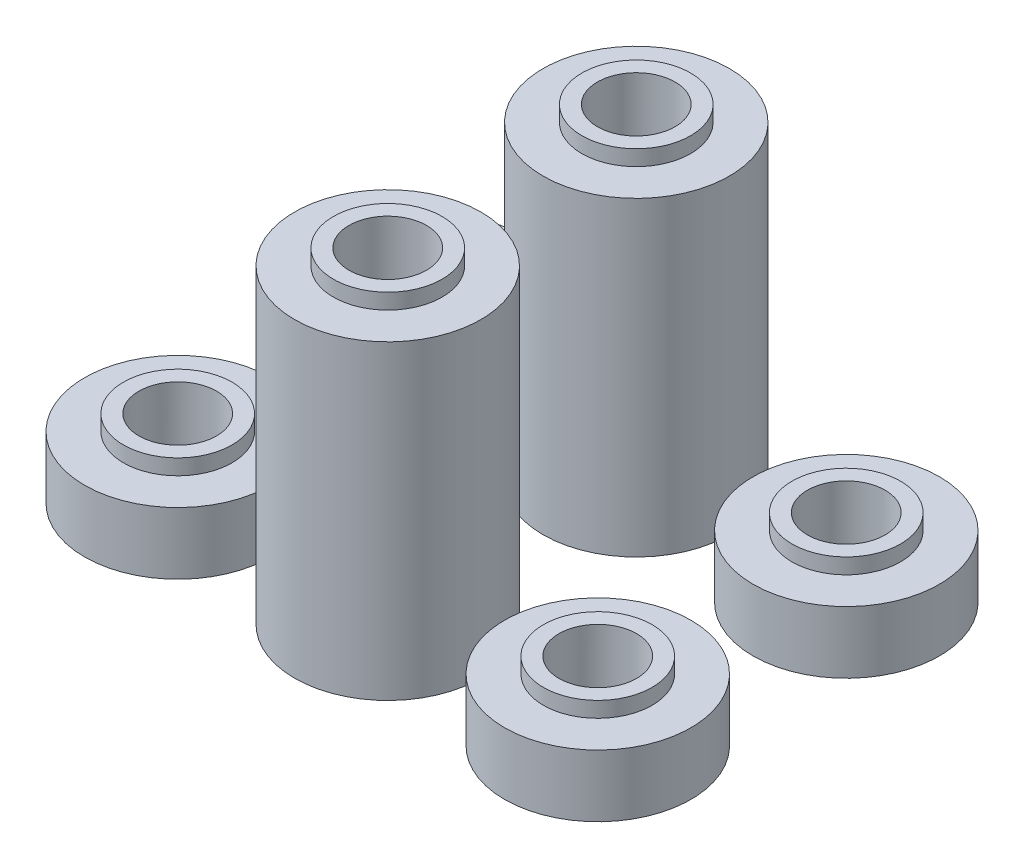
ISO-10303-21;
HEADER;
FILE_DESCRIPTION(('STEP AP214'),'2;1');
FILE_NAME('part.step','',(''),(''),'','','');
FILE_SCHEMA(('AUTOMOTIVE_DESIGN { 1 0 10303 214 1 1 1 1 }'));
ENDSEC;
DATA;
#1=APPLICATION_CONTEXT('core data for automotive mechanical design processes');
#2=APPLICATION_PROTOCOL_DEFINITION('international standard','automotive_design',2000,#1);
#3=PRODUCT_CONTEXT('',#1,'mechanical');
#4=PRODUCT('Part','Part','',(#3));
#5=PRODUCT_RELATED_PRODUCT_CATEGORY('part','',(#4));
#6=PRODUCT_DEFINITION_FORMATION('','',#4);
#7=PRODUCT_DEFINITION_CONTEXT('part definition',#1,'design');
#8=PRODUCT_DEFINITION('design','',#6,#7);
#9=PRODUCT_DEFINITION_SHAPE('','',#8);
#10=(LENGTH_UNIT() NAMED_UNIT(*) SI_UNIT(.MILLI.,.METRE.));
#11=(NAMED_UNIT(*) PLANE_ANGLE_UNIT() SI_UNIT($,.RADIAN.));
#12=(NAMED_UNIT(*) SI_UNIT($,.STERADIAN.) SOLID_ANGLE_UNIT());
#13=UNCERTAINTY_MEASURE_WITH_UNIT(LENGTH_MEASURE(1.E-05),#10,'distance_accuracy_value','');
#14=(GEOMETRIC_REPRESENTATION_CONTEXT(3) GLOBAL_UNCERTAINTY_ASSIGNED_CONTEXT((#13)) GLOBAL_UNIT_ASSIGNED_CONTEXT((#10,
#11,#12)) REPRESENTATION_CONTEXT('',''));
#15=CARTESIAN_POINT('',(0.,0.,0.));
#16=DIRECTION('',(0.,0.,1.));
#17=DIRECTION('',(1.,0.,0.));
#18=AXIS2_PLACEMENT_3D('',#15,#16,#17);
#19=CARTESIAN_POINT('',(-13.5219915750708,0.,16.));
#20=DIRECTION('',(0.,1.,0.));
#21=DIRECTION('',(0.,0.,-1.));
#22=AXIS2_PLACEMENT_3D('',#19,#20,#21);
#23=CYLINDRICAL_SURFACE('',#22,2.5);
#24=CARTESIAN_POINT('',(-13.5219915750708,5.,16.));
#25=DIRECTION('',(0.,-1.,0.));
#26=DIRECTION('',(0.,0.,-1.));
#27=AXIS2_PLACEMENT_3D('',#24,#25,#26);
#28=CIRCLE('',#27,2.5);
#29=CARTESIAN_POINT('',(-13.5219915750708,5.,13.5));
#30=VERTEX_POINT('',#29);
#31=EDGE_CURVE('E61',#30,#30,#28,.T.);
#32=ORIENTED_EDGE('',*,*,#31,.F.);
#33=EDGE_LOOP('',(#32));
#34=FACE_BOUND('',#33,.T.);
#35=CARTESIAN_POINT('',(-13.5219915750708,1.,16.));
#36=DIRECTION('',(0.,1.,0.));
#37=DIRECTION('',(0.,0.,1.));
#38=AXIS2_PLACEMENT_3D('',#35,#36,#37);
#39=CIRCLE('',#38,2.5);
#40=CARTESIAN_POINT('',(-13.5219915750708,1.,18.5));
#41=VERTEX_POINT('',#40);
#42=EDGE_CURVE('E70',#41,#41,#39,.T.);
#43=ORIENTED_EDGE('',*,*,#42,.F.);
#44=EDGE_LOOP('',(#43));
#45=FACE_BOUND('',#44,.T.);
#46=ADVANCED_FACE('F45',(#34,#45),#23,.F.);
#47=CARTESIAN_POINT('',(-13.5219915750708,4.,16.));
#48=DIRECTION('',(0.,1.,0.));
#49=DIRECTION('',(0.,0.,-1.));
#50=AXIS2_PLACEMENT_3D('',#47,#48,#49);
#51=PLANE('',#50);
#52=CARTESIAN_POINT('',(-13.5219915750708,4.,16.));
#53=DIRECTION('',(0.,-1.,0.));
#54=DIRECTION('',(0.,0.,-1.));
#55=AXIS2_PLACEMENT_3D('',#52,#53,#54);
#56=CIRCLE('',#55,6.);
#57=CARTESIAN_POINT('',(-13.5219915750708,4.,10.));
#58=VERTEX_POINT('',#57);
#59=EDGE_CURVE('E11',#58,#58,#56,.T.);
#60=ORIENTED_EDGE('',*,*,#59,.F.);
#61=EDGE_LOOP('',(#60));
#62=FACE_BOUND('',#61,.T.);
#63=CARTESIAN_POINT('',(-13.5219915750708,4.,16.));
#64=DIRECTION('',(0.,-1.,0.));
#65=DIRECTION('',(0.,0.,-1.));
#66=AXIS2_PLACEMENT_3D('',#63,#64,#65);
#67=CIRCLE('',#66,3.5);
#68=CARTESIAN_POINT('',(-13.5219915750708,4.,12.5));
#69=VERTEX_POINT('',#68);
#70=EDGE_CURVE('E58',#69,#69,#67,.T.);
#71=ORIENTED_EDGE('',*,*,#70,.T.);
#72=EDGE_LOOP('',(#71));
#73=FACE_BOUND('',#72,.T.);
#74=ADVANCED_FACE('F80',(#62,#73),#51,.T.);
#75=CARTESIAN_POINT('',(-13.5219915750708,4.,16.));
#76=DIRECTION('',(0.,-1.,0.));
#77=DIRECTION('',(0.,0.,1.));
#78=AXIS2_PLACEMENT_3D('',#75,#76,#77);
#79=CYLINDRICAL_SURFACE('',#78,6.);
#80=ORIENTED_EDGE('',*,*,#59,.T.);
#81=EDGE_LOOP('',(#80));
#82=FACE_BOUND('',#81,.T.);
#83=CARTESIAN_POINT('',(-13.5219915750708,0.,16.));
#84=DIRECTION('',(0.,-1.,0.));
#85=DIRECTION('',(0.,0.,-1.));
#86=AXIS2_PLACEMENT_3D('',#83,#84,#85);
#87=CIRCLE('',#86,6.);
#88=CARTESIAN_POINT('',(-13.5219915750708,0.,10.));
#89=VERTEX_POINT('',#88);
#90=EDGE_CURVE('E49',#89,#89,#87,.T.);
#91=ORIENTED_EDGE('',*,*,#90,.F.);
#92=EDGE_LOOP('',(#91));
#93=FACE_BOUND('',#92,.T.);
#94=ADVANCED_FACE('F47',(#82,#93),#79,.T.);
#95=CARTESIAN_POINT('',(-13.5219915750708,0.,16.));
#96=DIRECTION('',(0.,1.,0.));
#97=DIRECTION('',(0.,0.,-1.));
#98=AXIS2_PLACEMENT_3D('',#95,#96,#97);
#99=PLANE('',#98);
#100=CARTESIAN_POINT('',(-13.5219915750708,0.,16.));
#101=DIRECTION('',(0.,1.,0.));
#102=DIRECTION('',(0.,0.,1.));
#103=AXIS2_PLACEMENT_3D('',#100,#101,#102);
#104=CIRCLE('',#103,3.5);
#105=CARTESIAN_POINT('',(-13.5219915750708,0.,19.5));
#106=VERTEX_POINT('',#105);
#107=EDGE_CURVE('E67',#106,#106,#104,.T.);
#108=ORIENTED_EDGE('',*,*,#107,.T.);
#109=EDGE_LOOP('',(#108));
#110=FACE_BOUND('',#109,.T.);
#111=ORIENTED_EDGE('',*,*,#90,.T.);
#112=EDGE_LOOP('',(#111));
#113=FACE_BOUND('',#112,.T.);
#114=ADVANCED_FACE('F92',(#110,#113),#99,.F.);
#115=CARTESIAN_POINT('',(-13.5219915750708,5.,16.));
#116=DIRECTION('',(0.,1.,0.));
#117=DIRECTION('',(0.,0.,-1.));
#118=AXIS2_PLACEMENT_3D('',#115,#116,#117);
#119=PLANE('',#118);
#120=CARTESIAN_POINT('',(-13.5219915750708,5.,16.));
#121=DIRECTION('',(0.,-1.,0.));
#122=DIRECTION('',(0.,0.,-1.));
#123=AXIS2_PLACEMENT_3D('',#120,#121,#122);
#124=CIRCLE('',#123,3.5);
#125=CARTESIAN_POINT('',(-13.5219915750708,5.,12.5));
#126=VERTEX_POINT('',#125);
#127=EDGE_CURVE('E56',#126,#126,#124,.T.);
#128=ORIENTED_EDGE('',*,*,#127,.F.);
#129=EDGE_LOOP('',(#128));
#130=FACE_BOUND('',#129,.T.);
#131=ORIENTED_EDGE('',*,*,#31,.T.);
#132=EDGE_LOOP('',(#131));
#133=FACE_BOUND('',#132,.T.);
#134=ADVANCED_FACE('F94',(#130,#133),#119,.T.);
#135=CARTESIAN_POINT('',(-13.5219915750708,5.,16.));
#136=DIRECTION('',(0.,-1.,0.));
#137=DIRECTION('',(0.,0.,1.));
#138=AXIS2_PLACEMENT_3D('',#135,#136,#137);
#139=CYLINDRICAL_SURFACE('',#138,3.5);
#140=ORIENTED_EDGE('',*,*,#127,.T.);
#141=EDGE_LOOP('',(#140));
#142=FACE_BOUND('',#141,.T.);
#143=ORIENTED_EDGE('',*,*,#70,.F.);
#144=EDGE_LOOP('',(#143));
#145=FACE_BOUND('',#144,.T.);
#146=ADVANCED_FACE('F90',(#142,#145),#139,.T.);
#147=CARTESIAN_POINT('',(-13.5219915750708,1.,16.));
#148=DIRECTION('',(0.,-1.,0.));
#149=DIRECTION('',(0.,0.,1.));
#150=AXIS2_PLACEMENT_3D('',#147,#148,#149);
#151=CYLINDRICAL_SURFACE('',#150,3.5);
#152=CARTESIAN_POINT('',(-13.5219915750708,1.,16.));
#153=DIRECTION('',(0.,1.,0.));
#154=DIRECTION('',(0.,0.,1.));
#155=AXIS2_PLACEMENT_3D('',#152,#153,#154);
#156=CIRCLE('',#155,3.5);
#157=CARTESIAN_POINT('',(-13.5219915750708,1.,19.5));
#158=VERTEX_POINT('',#157);
#159=EDGE_CURVE('E66',#158,#158,#156,.T.);
#160=ORIENTED_EDGE('',*,*,#159,.T.);
#161=EDGE_LOOP('',(#160));
#162=FACE_BOUND('',#161,.T.);
#163=ORIENTED_EDGE('',*,*,#107,.F.);
#164=EDGE_LOOP('',(#163));
#165=FACE_BOUND('',#164,.T.);
#166=ADVANCED_FACE('F106',(#162,#165),#151,.F.);
#167=CARTESIAN_POINT('',(-13.5219915750708,1.,16.));
#168=DIRECTION('',(0.,-1.,0.));
#169=DIRECTION('',(0.,0.,1.));
#170=AXIS2_PLACEMENT_3D('',#167,#168,#169);
#171=PLANE('',#170);
#172=ORIENTED_EDGE('',*,*,#42,.T.);
#173=EDGE_LOOP('',(#172));
#174=FACE_BOUND('',#173,.T.);
#175=ORIENTED_EDGE('',*,*,#159,.F.);
#176=EDGE_LOOP('',(#175));
#177=FACE_BOUND('',#176,.T.);
#178=ADVANCED_FACE('F76',(#174,#177),#171,.T.);
#179=CLOSED_SHELL('',(#46,#74,#94,#114,#134,#146,#166,#178));
#180=MANIFOLD_SOLID_BREP('B2',#179);
#181=CARTESIAN_POINT('',(0.,0.,16.));
#182=DIRECTION('',(0.,1.,0.));
#183=DIRECTION('',(0.,0.,-1.));
#184=AXIS2_PLACEMENT_3D('',#181,#182,#183);
#185=CYLINDRICAL_SURFACE('',#184,2.5);
#186=CARTESIAN_POINT('',(0.,21.,16.));
#187=DIRECTION('',(0.,-1.,0.));
#188=DIRECTION('',(0.,0.,-1.));
#189=AXIS2_PLACEMENT_3D('',#186,#187,#188);
#190=CIRCLE('',#189,2.5);
#191=CARTESIAN_POINT('',(0.,21.,13.5));
#192=VERTEX_POINT('',#191);
#193=EDGE_CURVE('E198',#192,#192,#190,.T.);
#194=ORIENTED_EDGE('',*,*,#193,.F.);
#195=EDGE_LOOP('',(#194));
#196=FACE_BOUND('',#195,.T.);
#197=CARTESIAN_POINT('',(0.,5.,16.));
#198=DIRECTION('',(0.,1.,0.));
#199=DIRECTION('',(0.,0.,1.));
#200=AXIS2_PLACEMENT_3D('',#197,#198,#199);
#201=CIRCLE('',#200,2.5);
#202=CARTESIAN_POINT('',(0.,5.,18.5));
#203=VERTEX_POINT('',#202);
#204=EDGE_CURVE('E181',#203,#203,#201,.F.);
#205=ORIENTED_EDGE('',*,*,#204,.T.);
#206=EDGE_LOOP('',(#205));
#207=FACE_BOUND('',#206,.T.);
#208=ADVANCED_FACE('F177',(#196,#207),#185,.F.);
#209=CARTESIAN_POINT('',(0.,20.,16.));
#210=DIRECTION('',(0.,1.,0.));
#211=DIRECTION('',(0.,0.,-1.));
#212=AXIS2_PLACEMENT_3D('',#209,#210,#211);
#213=PLANE('',#212);
#214=CARTESIAN_POINT('',(0.,20.,16.));
#215=DIRECTION('',(0.,-1.,0.));
#216=DIRECTION('',(0.,0.,-1.));
#217=AXIS2_PLACEMENT_3D('',#214,#215,#216);
#218=CIRCLE('',#217,6.);
#219=CARTESIAN_POINT('',(0.,20.,10.));
#220=VERTEX_POINT('',#219);
#221=EDGE_CURVE('E44',#220,#220,#218,.T.);
#222=ORIENTED_EDGE('',*,*,#221,.F.);
#223=EDGE_LOOP('',(#222));
#224=FACE_BOUND('',#223,.T.);
#225=CARTESIAN_POINT('',(0.,20.,16.));
#226=DIRECTION('',(0.,-1.,0.));
#227=DIRECTION('',(0.,0.,-1.));
#228=AXIS2_PLACEMENT_3D('',#225,#226,#227);
#229=CIRCLE('',#228,3.5);
#230=CARTESIAN_POINT('',(0.,20.,12.5));
#231=VERTEX_POINT('',#230);
#232=EDGE_CURVE('E194',#231,#231,#229,.T.);
#233=ORIENTED_EDGE('',*,*,#232,.T.);
#234=EDGE_LOOP('',(#233));
#235=FACE_BOUND('',#234,.T.);
#236=ADVANCED_FACE('F234',(#224,#235),#213,.T.);
#237=CARTESIAN_POINT('',(0.,20.,16.));
#238=DIRECTION('',(0.,-1.,0.));
#239=DIRECTION('',(0.,0.,1.));
#240=AXIS2_PLACEMENT_3D('',#237,#238,#239);
#241=CYLINDRICAL_SURFACE('',#240,6.);
#242=ORIENTED_EDGE('',*,*,#221,.T.);
#243=EDGE_LOOP('',(#242));
#244=FACE_BOUND('',#243,.T.);
#245=CARTESIAN_POINT('',(0.,0.,16.));
#246=DIRECTION('',(0.,-1.,0.));
#247=DIRECTION('',(0.,0.,-1.));
#248=AXIS2_PLACEMENT_3D('',#245,#246,#247);
#249=CIRCLE('',#248,6.);
#250=CARTESIAN_POINT('',(0.,0.,10.));
#251=VERTEX_POINT('',#250);
#252=EDGE_CURVE('E186',#251,#251,#249,.T.);
#253=ORIENTED_EDGE('',*,*,#252,.F.);
#254=EDGE_LOOP('',(#253));
#255=FACE_BOUND('',#254,.T.);
#256=ADVANCED_FACE('F179',(#244,#255),#241,.T.);
#257=CARTESIAN_POINT('',(0.,0.,16.));
#258=DIRECTION('',(0.,1.,0.));
#259=DIRECTION('',(0.,0.,-1.));
#260=AXIS2_PLACEMENT_3D('',#257,#258,#259);
#261=PLANE('',#260);
#262=CARTESIAN_POINT('',(0.,0.,16.));
#263=DIRECTION('',(0.,1.,0.));
#264=DIRECTION('',(0.,0.,1.));
#265=AXIS2_PLACEMENT_3D('',#262,#263,#264);
#266=CIRCLE('',#265,4.5);
#267=CARTESIAN_POINT('',(0.,0.,20.5));
#268=VERTEX_POINT('',#267);
#269=EDGE_CURVE('E205',#268,#268,#266,.T.);
#270=ORIENTED_EDGE('',*,*,#269,.T.);
#271=EDGE_LOOP('',(#270));
#272=FACE_BOUND('',#271,.T.);
#273=ORIENTED_EDGE('',*,*,#252,.T.);
#274=EDGE_LOOP('',(#273));
#275=FACE_BOUND('',#274,.T.);
#276=ADVANCED_FACE('F244',(#272,#275),#261,.F.);
#277=CARTESIAN_POINT('',(0.,21.,16.));
#278=DIRECTION('',(0.,1.,0.));
#279=DIRECTION('',(0.,0.,-1.));
#280=AXIS2_PLACEMENT_3D('',#277,#278,#279);
#281=PLANE('',#280);
#282=CARTESIAN_POINT('',(0.,21.,16.));
#283=DIRECTION('',(0.,-1.,0.));
#284=DIRECTION('',(0.,0.,-1.));
#285=AXIS2_PLACEMENT_3D('',#282,#283,#284);
#286=CIRCLE('',#285,3.5);
#287=CARTESIAN_POINT('',(0.,21.,12.5));
#288=VERTEX_POINT('',#287);
#289=EDGE_CURVE('E192',#288,#288,#286,.T.);
#290=ORIENTED_EDGE('',*,*,#289,.F.);
#291=EDGE_LOOP('',(#290));
#292=FACE_BOUND('',#291,.T.);
#293=ORIENTED_EDGE('',*,*,#193,.T.);
#294=EDGE_LOOP('',(#293));
#295=FACE_BOUND('',#294,.T.);
#296=ADVANCED_FACE('F230',(#292,#295),#281,.T.);
#297=CARTESIAN_POINT('',(0.,21.,16.));
#298=DIRECTION('',(0.,-1.,0.));
#299=DIRECTION('',(0.,0.,1.));
#300=AXIS2_PLACEMENT_3D('',#297,#298,#299);
#301=CYLINDRICAL_SURFACE('',#300,3.5);
#302=ORIENTED_EDGE('',*,*,#289,.T.);
#303=EDGE_LOOP('',(#302));
#304=FACE_BOUND('',#303,.T.);
#305=ORIENTED_EDGE('',*,*,#232,.F.);
#306=EDGE_LOOP('',(#305));
#307=FACE_BOUND('',#306,.T.);
#308=ADVANCED_FACE('F222',(#304,#307),#301,.T.);
#309=CARTESIAN_POINT('',(0.,5.,16.));
#310=DIRECTION('',(0.,-1.,0.));
#311=DIRECTION('',(0.,0.,1.));
#312=AXIS2_PLACEMENT_3D('',#309,#310,#311);
#313=PLANE('',#312);
#314=CARTESIAN_POINT('',(0.,5.,16.));
#315=DIRECTION('',(0.,1.,0.));
#316=DIRECTION('',(0.,0.,1.));
#317=AXIS2_PLACEMENT_3D('',#314,#315,#316);
#318=CIRCLE('',#317,4.5);
#319=CARTESIAN_POINT('',(0.,5.,20.5));
#320=VERTEX_POINT('',#319);
#321=EDGE_CURVE('E209',#320,#320,#318,.T.);
#322=ORIENTED_EDGE('',*,*,#321,.F.);
#323=EDGE_LOOP('',(#322));
#324=FACE_BOUND('',#323,.T.);
#325=ORIENTED_EDGE('',*,*,#204,.F.);
#326=EDGE_LOOP('',(#325));
#327=FACE_BOUND('',#326,.T.);
#328=ADVANCED_FACE('F219',(#324,#327),#313,.T.);
#329=CARTESIAN_POINT('',(0.,5.,16.));
#330=DIRECTION('',(0.,-1.,0.));
#331=DIRECTION('',(0.,0.,1.));
#332=AXIS2_PLACEMENT_3D('',#329,#330,#331);
#333=CYLINDRICAL_SURFACE('',#332,4.5);
#334=ORIENTED_EDGE('',*,*,#321,.T.);
#335=EDGE_LOOP('',(#334));
#336=FACE_BOUND('',#335,.T.);
#337=ORIENTED_EDGE('',*,*,#269,.F.);
#338=EDGE_LOOP('',(#337));
#339=FACE_BOUND('',#338,.T.);
#340=ADVANCED_FACE('F221',(#336,#339),#333,.F.);
#341=CLOSED_SHELL('',(#208,#236,#256,#276,#296,#308,#328,#340));
#342=MANIFOLD_SOLID_BREP('B6',#341);
#343=CARTESIAN_POINT('',(13.5219915750708,0.,16.));
#344=DIRECTION('',(0.,1.,0.));
#345=DIRECTION('',(0.,0.,-1.));
#346=AXIS2_PLACEMENT_3D('',#343,#344,#345);
#347=CYLINDRICAL_SURFACE('',#346,2.5);
#348=CARTESIAN_POINT('',(13.5219915750708,5.,16.));
#349=DIRECTION('',(0.,1.,0.));
#350=DIRECTION('',(0.,0.,-1.));
#351=AXIS2_PLACEMENT_3D('',#348,#349,#350);
#352=CIRCLE('',#351,2.5);
#353=CARTESIAN_POINT('',(13.5219915750708,5.,13.5));
#354=VERTEX_POINT('',#353);
#355=EDGE_CURVE('E333',#354,#354,#352,.T.);
#356=ORIENTED_EDGE('',*,*,#355,.T.);
#357=EDGE_LOOP('',(#356));
#358=FACE_BOUND('',#357,.T.);
#359=CARTESIAN_POINT('',(13.5219915750708,1.,16.));
#360=DIRECTION('',(0.,-1.,0.));
#361=DIRECTION('',(0.,0.,1.));
#362=AXIS2_PLACEMENT_3D('',#359,#360,#361);
#363=CIRCLE('',#362,2.5);
#364=CARTESIAN_POINT('',(13.5219915750708,1.,18.5));
#365=VERTEX_POINT('',#364);
#366=EDGE_CURVE('E342',#365,#365,#363,.T.);
#367=ORIENTED_EDGE('',*,*,#366,.T.);
#368=EDGE_LOOP('',(#367));
#369=FACE_BOUND('',#368,.T.);
#370=ADVANCED_FACE('F317',(#358,#369),#347,.F.);
#371=CARTESIAN_POINT('',(13.5219915750708,4.,16.));
#372=DIRECTION('',(0.,1.,0.));
#373=DIRECTION('',(0.,0.,-1.));
#374=AXIS2_PLACEMENT_3D('',#371,#372,#373);
#375=PLANE('',#374);
#376=CARTESIAN_POINT('',(13.5219915750708,4.,16.));
#377=DIRECTION('',(0.,1.,0.));
#378=DIRECTION('',(0.,0.,-1.));
#379=AXIS2_PLACEMENT_3D('',#376,#377,#378);
#380=CIRCLE('',#379,6.);
#381=CARTESIAN_POINT('',(13.5219915750708,4.,10.));
#382=VERTEX_POINT('',#381);
#383=EDGE_CURVE('E176',#382,#382,#380,.T.);
#384=ORIENTED_EDGE('',*,*,#383,.T.);
#385=EDGE_LOOP('',(#384));
#386=FACE_BOUND('',#385,.T.);
#387=CARTESIAN_POINT('',(13.5219915750708,4.,16.));
#388=DIRECTION('',(0.,1.,0.));
#389=DIRECTION('',(0.,0.,-1.));
#390=AXIS2_PLACEMENT_3D('',#387,#388,#389);
#391=CIRCLE('',#390,3.5);
#392=CARTESIAN_POINT('',(13.5219915750708,4.,12.5));
#393=VERTEX_POINT('',#392);
#394=EDGE_CURVE('E330',#393,#393,#391,.T.);
#395=ORIENTED_EDGE('',*,*,#394,.F.);
#396=EDGE_LOOP('',(#395));
#397=FACE_BOUND('',#396,.T.);
#398=ADVANCED_FACE('F369',(#386,#397),#375,.T.);
#399=CARTESIAN_POINT('',(13.5219915750708,4.,16.));
#400=DIRECTION('',(0.,-1.,0.));
#401=DIRECTION('',(0.,0.,1.));
#402=AXIS2_PLACEMENT_3D('',#399,#400,#401);
#403=CYLINDRICAL_SURFACE('',#402,6.);
#404=ORIENTED_EDGE('',*,*,#383,.F.);
#405=EDGE_LOOP('',(#404));
#406=FACE_BOUND('',#405,.T.);
#407=CARTESIAN_POINT('',(13.5219915750708,0.,16.));
#408=DIRECTION('',(0.,1.,0.));
#409=DIRECTION('',(0.,0.,-1.));
#410=AXIS2_PLACEMENT_3D('',#407,#408,#409);
#411=CIRCLE('',#410,6.);
#412=CARTESIAN_POINT('',(13.5219915750708,0.,10.));
#413=VERTEX_POINT('',#412);
#414=EDGE_CURVE('E321',#413,#413,#411,.T.);
#415=ORIENTED_EDGE('',*,*,#414,.T.);
#416=EDGE_LOOP('',(#415));
#417=FACE_BOUND('',#416,.T.);
#418=ADVANCED_FACE('F319',(#406,#417),#403,.T.);
#419=CARTESIAN_POINT('',(13.5219915750708,0.,16.));
#420=DIRECTION('',(0.,1.,0.));
#421=DIRECTION('',(0.,0.,-1.));
#422=AXIS2_PLACEMENT_3D('',#419,#420,#421);
#423=PLANE('',#422);
#424=CARTESIAN_POINT('',(13.5219915750708,0.,16.));
#425=DIRECTION('',(0.,-1.,0.));
#426=DIRECTION('',(0.,0.,1.));
#427=AXIS2_PLACEMENT_3D('',#424,#425,#426);
#428=CIRCLE('',#427,3.5);
#429=CARTESIAN_POINT('',(13.5219915750708,0.,19.5));
#430=VERTEX_POINT('',#429);
#431=EDGE_CURVE('E339',#430,#430,#428,.T.);
#432=ORIENTED_EDGE('',*,*,#431,.F.);
#433=EDGE_LOOP('',(#432));
#434=FACE_BOUND('',#433,.T.);
#435=ORIENTED_EDGE('',*,*,#414,.F.);
#436=EDGE_LOOP('',(#435));
#437=FACE_BOUND('',#436,.T.);
#438=ADVANCED_FACE('F362',(#434,#437),#423,.F.);
#439=CARTESIAN_POINT('',(13.5219915750708,5.,16.));
#440=DIRECTION('',(0.,1.,0.));
#441=DIRECTION('',(0.,0.,-1.));
#442=AXIS2_PLACEMENT_3D('',#439,#440,#441);
#443=PLANE('',#442);
#444=CARTESIAN_POINT('',(13.5219915750708,5.,16.));
#445=DIRECTION('',(0.,1.,0.));
#446=DIRECTION('',(0.,0.,-1.));
#447=AXIS2_PLACEMENT_3D('',#444,#445,#446);
#448=CIRCLE('',#447,3.5);
#449=CARTESIAN_POINT('',(13.5219915750708,5.,12.5));
#450=VERTEX_POINT('',#449);
#451=EDGE_CURVE('E328',#450,#450,#448,.T.);
#452=ORIENTED_EDGE('',*,*,#451,.T.);
#453=EDGE_LOOP('',(#452));
#454=FACE_BOUND('',#453,.T.);
#455=ORIENTED_EDGE('',*,*,#355,.F.);
#456=EDGE_LOOP('',(#455));
#457=FACE_BOUND('',#456,.T.);
#458=ADVANCED_FACE('F365',(#454,#457),#443,.T.);
#459=CARTESIAN_POINT('',(13.5219915750708,5.,16.));
#460=DIRECTION('',(0.,-1.,0.));
#461=DIRECTION('',(0.,0.,1.));
#462=AXIS2_PLACEMENT_3D('',#459,#460,#461);
#463=CYLINDRICAL_SURFACE('',#462,3.5);
#464=ORIENTED_EDGE('',*,*,#451,.F.);
#465=EDGE_LOOP('',(#464));
#466=FACE_BOUND('',#465,.T.);
#467=ORIENTED_EDGE('',*,*,#394,.T.);
#468=EDGE_LOOP('',(#467));
#469=FACE_BOUND('',#468,.T.);
#470=ADVANCED_FACE('F358',(#466,#469),#463,.T.);
#471=CARTESIAN_POINT('',(13.5219915750708,1.,16.));
#472=DIRECTION('',(0.,-1.,0.));
#473=DIRECTION('',(0.,0.,1.));
#474=AXIS2_PLACEMENT_3D('',#471,#472,#473);
#475=CYLINDRICAL_SURFACE('',#474,3.5);
#476=CARTESIAN_POINT('',(13.5219915750708,1.,16.));
#477=DIRECTION('',(0.,-1.,0.));
#478=DIRECTION('',(0.,0.,1.));
#479=AXIS2_PLACEMENT_3D('',#476,#477,#478);
#480=CIRCLE('',#479,3.5);
#481=CARTESIAN_POINT('',(13.5219915750708,1.,19.5));
#482=VERTEX_POINT('',#481);
#483=EDGE_CURVE('E338',#482,#482,#480,.T.);
#484=ORIENTED_EDGE('',*,*,#483,.F.);
#485=EDGE_LOOP('',(#484));
#486=FACE_BOUND('',#485,.T.);
#487=ORIENTED_EDGE('',*,*,#431,.T.);
#488=EDGE_LOOP('',(#487));
#489=FACE_BOUND('',#488,.T.);
#490=ADVANCED_FACE('F352',(#486,#489),#475,.F.);
#491=CARTESIAN_POINT('',(13.5219915750708,1.,16.));
#492=DIRECTION('',(0.,-1.,0.));
#493=DIRECTION('',(0.,0.,1.));
#494=AXIS2_PLACEMENT_3D('',#491,#492,#493);
#495=PLANE('',#494);
#496=ORIENTED_EDGE('',*,*,#366,.F.);
#497=EDGE_LOOP('',(#496));
#498=FACE_BOUND('',#497,.T.);
#499=ORIENTED_EDGE('',*,*,#483,.T.);
#500=EDGE_LOOP('',(#499));
#501=FACE_BOUND('',#500,.T.);
#502=ADVANCED_FACE('F349',(#498,#501),#495,.T.);
#503=CLOSED_SHELL('',(#370,#398,#418,#438,#458,#470,#490,#502));
#504=MANIFOLD_SOLID_BREP('B39',#503);
#505=CARTESIAN_POINT('',(13.5219915750708,0.,0.));
#506=DIRECTION('',(0.,1.,0.));
#507=DIRECTION('',(0.,0.,1.));
#508=AXIS2_PLACEMENT_3D('',#505,#506,#507);
#509=CYLINDRICAL_SURFACE('',#508,2.5);
#510=CARTESIAN_POINT('',(13.5219915750708,5.,0.));
#511=DIRECTION('',(0.,-1.,0.));
#512=DIRECTION('',(0.,0.,1.));
#513=AXIS2_PLACEMENT_3D('',#510,#511,#512);
#514=CIRCLE('',#513,2.5);
#515=CARTESIAN_POINT('',(13.5219915750708,5.,2.5));
#516=VERTEX_POINT('',#515);
#517=EDGE_CURVE('E465',#516,#516,#514,.T.);
#518=ORIENTED_EDGE('',*,*,#517,.F.);
#519=EDGE_LOOP('',(#518));
#520=FACE_BOUND('',#519,.T.);
#521=CARTESIAN_POINT('',(13.5219915750708,1.,0.));
#522=DIRECTION('',(0.,1.,0.));
#523=DIRECTION('',(0.,0.,-1.));
#524=AXIS2_PLACEMENT_3D('',#521,#522,#523);
#525=CIRCLE('',#524,2.5);
#526=CARTESIAN_POINT('',(13.5219915750708,1.,-2.5));
#527=VERTEX_POINT('',#526);
#528=EDGE_CURVE('E474',#527,#527,#525,.T.);
#529=ORIENTED_EDGE('',*,*,#528,.F.);
#530=EDGE_LOOP('',(#529));
#531=FACE_BOUND('',#530,.T.);
#532=ADVANCED_FACE('F449',(#520,#531),#509,.F.);
#533=CARTESIAN_POINT('',(13.5219915750708,4.,0.));
#534=DIRECTION('',(0.,1.,0.));
#535=DIRECTION('',(0.,0.,1.));
#536=AXIS2_PLACEMENT_3D('',#533,#534,#535);
#537=PLANE('',#536);
#538=CARTESIAN_POINT('',(13.5219915750708,4.,0.));
#539=DIRECTION('',(0.,-1.,0.));
#540=DIRECTION('',(0.,0.,1.));
#541=AXIS2_PLACEMENT_3D('',#538,#539,#540);
#542=CIRCLE('',#541,6.);
#543=CARTESIAN_POINT('',(13.5219915750708,4.,6.));
#544=VERTEX_POINT('',#543);
#545=EDGE_CURVE('E316',#544,#544,#542,.T.);
#546=ORIENTED_EDGE('',*,*,#545,.F.);
#547=EDGE_LOOP('',(#546));
#548=FACE_BOUND('',#547,.T.);
#549=CARTESIAN_POINT('',(13.5219915750708,4.,0.));
#550=DIRECTION('',(0.,-1.,0.));
#551=DIRECTION('',(0.,0.,1.));
#552=AXIS2_PLACEMENT_3D('',#549,#550,#551);
#553=CIRCLE('',#552,3.5);
#554=CARTESIAN_POINT('',(13.5219915750708,4.,3.5));
#555=VERTEX_POINT('',#554);
#556=EDGE_CURVE('E462',#555,#555,#553,.T.);
#557=ORIENTED_EDGE('',*,*,#556,.T.);
#558=EDGE_LOOP('',(#557));
#559=FACE_BOUND('',#558,.T.);
#560=ADVANCED_FACE('F484',(#548,#559),#537,.T.);
#561=CARTESIAN_POINT('',(13.5219915750708,4.,0.));
#562=DIRECTION('',(0.,-1.,0.));
#563=DIRECTION('',(0.,0.,-1.));
#564=AXIS2_PLACEMENT_3D('',#561,#562,#563);
#565=CYLINDRICAL_SURFACE('',#564,6.);
#566=ORIENTED_EDGE('',*,*,#545,.T.);
#567=EDGE_LOOP('',(#566));
#568=FACE_BOUND('',#567,.T.);
#569=CARTESIAN_POINT('',(13.5219915750708,0.,0.));
#570=DIRECTION('',(0.,-1.,0.));
#571=DIRECTION('',(0.,0.,1.));
#572=AXIS2_PLACEMENT_3D('',#569,#570,#571);
#573=CIRCLE('',#572,6.);
#574=CARTESIAN_POINT('',(13.5219915750708,0.,6.));
#575=VERTEX_POINT('',#574);
#576=EDGE_CURVE('E453',#575,#575,#573,.T.);
#577=ORIENTED_EDGE('',*,*,#576,.F.);
#578=EDGE_LOOP('',(#577));
#579=FACE_BOUND('',#578,.T.);
#580=ADVANCED_FACE('F451',(#568,#579),#565,.T.);
#581=CARTESIAN_POINT('',(13.5219915750708,0.,0.));
#582=DIRECTION('',(0.,1.,0.));
#583=DIRECTION('',(0.,0.,1.));
#584=AXIS2_PLACEMENT_3D('',#581,#582,#583);
#585=PLANE('',#584);
#586=CARTESIAN_POINT('',(13.5219915750708,0.,0.));
#587=DIRECTION('',(0.,1.,0.));
#588=DIRECTION('',(0.,0.,-1.));
#589=AXIS2_PLACEMENT_3D('',#586,#587,#588);
#590=CIRCLE('',#589,3.5);
#591=CARTESIAN_POINT('',(13.5219915750708,0.,-3.5));
#592=VERTEX_POINT('',#591);
#593=EDGE_CURVE('E471',#592,#592,#590,.T.);
#594=ORIENTED_EDGE('',*,*,#593,.T.);
#595=EDGE_LOOP('',(#594));
#596=FACE_BOUND('',#595,.T.);
#597=ORIENTED_EDGE('',*,*,#576,.T.);
#598=EDGE_LOOP('',(#597));
#599=FACE_BOUND('',#598,.T.);
#600=ADVANCED_FACE('F496',(#596,#599),#585,.F.);
#601=CARTESIAN_POINT('',(13.5219915750708,5.,0.));
#602=DIRECTION('',(0.,1.,0.));
#603=DIRECTION('',(0.,0.,1.));
#604=AXIS2_PLACEMENT_3D('',#601,#602,#603);
#605=PLANE('',#604);
#606=CARTESIAN_POINT('',(13.5219915750708,5.,0.));
#607=DIRECTION('',(0.,-1.,0.));
#608=DIRECTION('',(0.,0.,1.));
#609=AXIS2_PLACEMENT_3D('',#606,#607,#608);
#610=CIRCLE('',#609,3.5);
#611=CARTESIAN_POINT('',(13.5219915750708,5.,3.5));
#612=VERTEX_POINT('',#611);
#613=EDGE_CURVE('E460',#612,#612,#610,.T.);
#614=ORIENTED_EDGE('',*,*,#613,.F.);
#615=EDGE_LOOP('',(#614));
#616=FACE_BOUND('',#615,.T.);
#617=ORIENTED_EDGE('',*,*,#517,.T.);
#618=EDGE_LOOP('',(#617));
#619=FACE_BOUND('',#618,.T.);
#620=ADVANCED_FACE('F498',(#616,#619),#605,.T.);
#621=CARTESIAN_POINT('',(13.5219915750708,5.,0.));
#622=DIRECTION('',(0.,-1.,0.));
#623=DIRECTION('',(0.,0.,-1.));
#624=AXIS2_PLACEMENT_3D('',#621,#622,#623);
#625=CYLINDRICAL_SURFACE('',#624,3.5);
#626=ORIENTED_EDGE('',*,*,#613,.T.);
#627=EDGE_LOOP('',(#626));
#628=FACE_BOUND('',#627,.T.);
#629=ORIENTED_EDGE('',*,*,#556,.F.);
#630=EDGE_LOOP('',(#629));
#631=FACE_BOUND('',#630,.T.);
#632=ADVANCED_FACE('F494',(#628,#631),#625,.T.);
#633=CARTESIAN_POINT('',(13.5219915750708,1.,0.));
#634=DIRECTION('',(0.,-1.,0.));
#635=DIRECTION('',(0.,0.,-1.));
#636=AXIS2_PLACEMENT_3D('',#633,#634,#635);
#637=CYLINDRICAL_SURFACE('',#636,3.5);
#638=CARTESIAN_POINT('',(13.5219915750708,1.,0.));
#639=DIRECTION('',(0.,1.,0.));
#640=DIRECTION('',(0.,0.,-1.));
#641=AXIS2_PLACEMENT_3D('',#638,#639,#640);
#642=CIRCLE('',#641,3.5);
#643=CARTESIAN_POINT('',(13.5219915750708,1.,-3.5));
#644=VERTEX_POINT('',#643);
#645=EDGE_CURVE('E470',#644,#644,#642,.T.);
#646=ORIENTED_EDGE('',*,*,#645,.T.);
#647=EDGE_LOOP('',(#646));
#648=FACE_BOUND('',#647,.T.);
#649=ORIENTED_EDGE('',*,*,#593,.F.);
#650=EDGE_LOOP('',(#649));
#651=FACE_BOUND('',#650,.T.);
#652=ADVANCED_FACE('F510',(#648,#651),#637,.F.);
#653=CARTESIAN_POINT('',(13.5219915750708,1.,0.));
#654=DIRECTION('',(0.,-1.,0.));
#655=DIRECTION('',(0.,0.,-1.));
#656=AXIS2_PLACEMENT_3D('',#653,#654,#655);
#657=PLANE('',#656);
#658=ORIENTED_EDGE('',*,*,#528,.T.);
#659=EDGE_LOOP('',(#658));
#660=FACE_BOUND('',#659,.T.);
#661=ORIENTED_EDGE('',*,*,#645,.F.);
#662=EDGE_LOOP('',(#661));
#663=FACE_BOUND('',#662,.T.);
#664=ADVANCED_FACE('F480',(#660,#663),#657,.T.);
#665=CLOSED_SHELL('',(#532,#560,#580,#600,#620,#632,#652,#664));
#666=MANIFOLD_SOLID_BREP('B171',#665);
#667=CARTESIAN_POINT('',(-13.5219915750708,0.,0.));
#668=DIRECTION('',(0.,1.,0.));
#669=DIRECTION('',(0.,0.,1.));
#670=AXIS2_PLACEMENT_3D('',#667,#668,#669);
#671=CYLINDRICAL_SURFACE('',#670,2.5);
#672=CARTESIAN_POINT('',(-13.5219915750708,5.,0.));
#673=DIRECTION('',(0.,1.,0.));
#674=DIRECTION('',(0.,0.,1.));
#675=AXIS2_PLACEMENT_3D('',#672,#673,#674);
#676=CIRCLE('',#675,2.5);
#677=CARTESIAN_POINT('',(-13.5219915750708,5.,2.5));
#678=VERTEX_POINT('',#677);
#679=EDGE_CURVE('E596',#678,#678,#676,.T.);
#680=ORIENTED_EDGE('',*,*,#679,.T.);
#681=EDGE_LOOP('',(#680));
#682=FACE_BOUND('',#681,.T.);
#683=CARTESIAN_POINT('',(-13.5219915750708,1.,0.));
#684=DIRECTION('',(0.,-1.,0.));
#685=DIRECTION('',(0.,0.,-1.));
#686=AXIS2_PLACEMENT_3D('',#683,#684,#685);
#687=CIRCLE('',#686,2.5);
#688=CARTESIAN_POINT('',(-13.5219915750708,1.,-2.5));
#689=VERTEX_POINT('',#688);
#690=EDGE_CURVE('E605',#689,#689,#687,.T.);
#691=ORIENTED_EDGE('',*,*,#690,.T.);
#692=EDGE_LOOP('',(#691));
#693=FACE_BOUND('',#692,.T.);
#694=ADVANCED_FACE('F580',(#682,#693),#671,.F.);
#695=CARTESIAN_POINT('',(-13.5219915750708,4.,0.));
#696=DIRECTION('',(0.,1.,0.));
#697=DIRECTION('',(0.,0.,1.));
#698=AXIS2_PLACEMENT_3D('',#695,#696,#697);
#699=PLANE('',#698);
#700=CARTESIAN_POINT('',(-13.5219915750708,4.,0.));
#701=DIRECTION('',(0.,1.,0.));
#702=DIRECTION('',(0.,0.,1.));
#703=AXIS2_PLACEMENT_3D('',#700,#701,#702);
#704=CIRCLE('',#703,6.);
#705=CARTESIAN_POINT('',(-13.5219915750708,4.,6.));
#706=VERTEX_POINT('',#705);
#707=EDGE_CURVE('E448',#706,#706,#704,.T.);
#708=ORIENTED_EDGE('',*,*,#707,.T.);
#709=EDGE_LOOP('',(#708));
#710=FACE_BOUND('',#709,.T.);
#711=CARTESIAN_POINT('',(-13.5219915750708,4.,0.));
#712=DIRECTION('',(0.,1.,0.));
#713=DIRECTION('',(0.,0.,1.));
#714=AXIS2_PLACEMENT_3D('',#711,#712,#713);
#715=CIRCLE('',#714,3.5);
#716=CARTESIAN_POINT('',(-13.5219915750708,4.,3.5));
#717=VERTEX_POINT('',#716);
#718=EDGE_CURVE('E593',#717,#717,#715,.T.);
#719=ORIENTED_EDGE('',*,*,#718,.F.);
#720=EDGE_LOOP('',(#719));
#721=FACE_BOUND('',#720,.T.);
#722=ADVANCED_FACE('F632',(#710,#721),#699,.T.);
#723=CARTESIAN_POINT('',(-13.5219915750708,4.,0.));
#724=DIRECTION('',(0.,-1.,0.));
#725=DIRECTION('',(0.,0.,-1.));
#726=AXIS2_PLACEMENT_3D('',#723,#724,#725);
#727=CYLINDRICAL_SURFACE('',#726,6.);
#728=ORIENTED_EDGE('',*,*,#707,.F.);
#729=EDGE_LOOP('',(#728));
#730=FACE_BOUND('',#729,.T.);
#731=CARTESIAN_POINT('',(-13.5219915750708,0.,0.));
#732=DIRECTION('',(0.,1.,0.));
#733=DIRECTION('',(0.,0.,1.));
#734=AXIS2_PLACEMENT_3D('',#731,#732,#733);
#735=CIRCLE('',#734,6.);
#736=CARTESIAN_POINT('',(-13.5219915750708,0.,6.));
#737=VERTEX_POINT('',#736);
#738=EDGE_CURVE('E584',#737,#737,#735,.T.);
#739=ORIENTED_EDGE('',*,*,#738,.T.);
#740=EDGE_LOOP('',(#739));
#741=FACE_BOUND('',#740,.T.);
#742=ADVANCED_FACE('F582',(#730,#741),#727,.T.);
#743=CARTESIAN_POINT('',(-13.5219915750708,0.,0.));
#744=DIRECTION('',(0.,1.,0.));
#745=DIRECTION('',(0.,0.,1.));
#746=AXIS2_PLACEMENT_3D('',#743,#744,#745);
#747=PLANE('',#746);
#748=CARTESIAN_POINT('',(-13.5219915750708,0.,0.));
#749=DIRECTION('',(0.,-1.,0.));
#750=DIRECTION('',(0.,0.,-1.));
#751=AXIS2_PLACEMENT_3D('',#748,#749,#750);
#752=CIRCLE('',#751,3.5);
#753=CARTESIAN_POINT('',(-13.5219915750708,0.,-3.5));
#754=VERTEX_POINT('',#753);
#755=EDGE_CURVE('E602',#754,#754,#752,.T.);
#756=ORIENTED_EDGE('',*,*,#755,.F.);
#757=EDGE_LOOP('',(#756));
#758=FACE_BOUND('',#757,.T.);
#759=ORIENTED_EDGE('',*,*,#738,.F.);
#760=EDGE_LOOP('',(#759));
#761=FACE_BOUND('',#760,.T.);
#762=ADVANCED_FACE('F625',(#758,#761),#747,.F.);
#763=CARTESIAN_POINT('',(-13.5219915750708,5.,0.));
#764=DIRECTION('',(0.,1.,0.));
#765=DIRECTION('',(0.,0.,1.));
#766=AXIS2_PLACEMENT_3D('',#763,#764,#765);
#767=PLANE('',#766);
#768=CARTESIAN_POINT('',(-13.5219915750708,5.,0.));
#769=DIRECTION('',(0.,1.,0.));
#770=DIRECTION('',(0.,0.,1.));
#771=AXIS2_PLACEMENT_3D('',#768,#769,#770);
#772=CIRCLE('',#771,3.5);
#773=CARTESIAN_POINT('',(-13.5219915750708,5.,3.5));
#774=VERTEX_POINT('',#773);
#775=EDGE_CURVE('E591',#774,#774,#772,.T.);
#776=ORIENTED_EDGE('',*,*,#775,.T.);
#777=EDGE_LOOP('',(#776));
#778=FACE_BOUND('',#777,.T.);
#779=ORIENTED_EDGE('',*,*,#679,.F.);
#780=EDGE_LOOP('',(#779));
#781=FACE_BOUND('',#780,.T.);
#782=ADVANCED_FACE('F628',(#778,#781),#767,.T.);
#783=CARTESIAN_POINT('',(-13.5219915750708,5.,0.));
#784=DIRECTION('',(0.,-1.,0.));
#785=DIRECTION('',(0.,0.,-1.));
#786=AXIS2_PLACEMENT_3D('',#783,#784,#785);
#787=CYLINDRICAL_SURFACE('',#786,3.5);
#788=ORIENTED_EDGE('',*,*,#775,.F.);
#789=EDGE_LOOP('',(#788));
#790=FACE_BOUND('',#789,.T.);
#791=ORIENTED_EDGE('',*,*,#718,.T.);
#792=EDGE_LOOP('',(#791));
#793=FACE_BOUND('',#792,.T.);
#794=ADVANCED_FACE('F621',(#790,#793),#787,.T.);
#795=CARTESIAN_POINT('',(-13.5219915750708,1.,0.));
#796=DIRECTION('',(0.,-1.,0.));
#797=DIRECTION('',(0.,0.,-1.));
#798=AXIS2_PLACEMENT_3D('',#795,#796,#797);
#799=CYLINDRICAL_SURFACE('',#798,3.5);
#800=CARTESIAN_POINT('',(-13.5219915750708,1.,0.));
#801=DIRECTION('',(0.,-1.,0.));
#802=DIRECTION('',(0.,0.,-1.));
#803=AXIS2_PLACEMENT_3D('',#800,#801,#802);
#804=CIRCLE('',#803,3.5);
#805=CARTESIAN_POINT('',(-13.5219915750708,1.,-3.5));
#806=VERTEX_POINT('',#805);
#807=EDGE_CURVE('E601',#806,#806,#804,.T.);
#808=ORIENTED_EDGE('',*,*,#807,.F.);
#809=EDGE_LOOP('',(#808));
#810=FACE_BOUND('',#809,.T.);
#811=ORIENTED_EDGE('',*,*,#755,.T.);
#812=EDGE_LOOP('',(#811));
#813=FACE_BOUND('',#812,.T.);
#814=ADVANCED_FACE('F615',(#810,#813),#799,.F.);
#815=CARTESIAN_POINT('',(-13.5219915750708,1.,0.));
#816=DIRECTION('',(0.,-1.,0.));
#817=DIRECTION('',(0.,0.,-1.));
#818=AXIS2_PLACEMENT_3D('',#815,#816,#817);
#819=PLANE('',#818);
#820=ORIENTED_EDGE('',*,*,#690,.F.);
#821=EDGE_LOOP('',(#820));
#822=FACE_BOUND('',#821,.T.);
#823=ORIENTED_EDGE('',*,*,#807,.T.);
#824=EDGE_LOOP('',(#823));
#825=FACE_BOUND('',#824,.T.);
#826=ADVANCED_FACE('F612',(#822,#825),#819,.T.);
#827=CLOSED_SHELL('',(#694,#722,#742,#762,#782,#794,#814,#826));
#828=MANIFOLD_SOLID_BREP('B311',#827);
#829=CARTESIAN_POINT('',(0.,0.,0.));
#830=DIRECTION('',(0.,1.,0.));
#831=DIRECTION('',(0.,0.,1.));
#832=AXIS2_PLACEMENT_3D('',#829,#830,#831);
#833=CYLINDRICAL_SURFACE('',#832,2.5);
#834=CARTESIAN_POINT('',(0.,21.,0.));
#835=DIRECTION('',(0.,1.,0.));
#836=DIRECTION('',(0.,0.,1.));
#837=AXIS2_PLACEMENT_3D('',#834,#835,#836);
#838=CIRCLE('',#837,2.5);
#839=CARTESIAN_POINT('',(0.,21.,2.5));
#840=VERTEX_POINT('',#839);
#841=EDGE_CURVE('E722',#840,#840,#838,.T.);
#842=ORIENTED_EDGE('',*,*,#841,.T.);
#843=EDGE_LOOP('',(#842));
#844=FACE_BOUND('',#843,.T.);
#845=CARTESIAN_POINT('',(0.,5.,0.));
#846=DIRECTION('',(0.,-1.,0.));
#847=DIRECTION('',(0.,0.,-1.));
#848=AXIS2_PLACEMENT_3D('',#845,#846,#847);
#849=CIRCLE('',#848,2.5);
#850=CARTESIAN_POINT('',(0.,5.,-2.5));
#851=VERTEX_POINT('',#850);
#852=EDGE_CURVE('E708',#851,#851,#849,.F.);
#853=ORIENTED_EDGE('',*,*,#852,.F.);
#854=EDGE_LOOP('',(#853));
#855=FACE_BOUND('',#854,.T.);
#856=ADVANCED_FACE('F704',(#844,#855),#833,.F.);
#857=CARTESIAN_POINT('',(0.,20.,0.));
#858=DIRECTION('',(0.,1.,0.));
#859=DIRECTION('',(0.,0.,1.));
#860=AXIS2_PLACEMENT_3D('',#857,#858,#859);
#861=PLANE('',#860);
#862=CARTESIAN_POINT('',(0.,20.,0.));
#863=DIRECTION('',(0.,1.,0.));
#864=DIRECTION('',(0.,0.,1.));
#865=AXIS2_PLACEMENT_3D('',#862,#863,#864);
#866=CIRCLE('',#865,6.);
#867=CARTESIAN_POINT('',(0.,20.,6.));
#868=VERTEX_POINT('',#867);
#869=EDGE_CURVE('E579',#868,#868,#866,.T.);
#870=ORIENTED_EDGE('',*,*,#869,.T.);
#871=EDGE_LOOP('',(#870));
#872=FACE_BOUND('',#871,.T.);
#873=CARTESIAN_POINT('',(0.,20.,0.));
#874=DIRECTION('',(0.,1.,0.));
#875=DIRECTION('',(0.,0.,1.));
#876=AXIS2_PLACEMENT_3D('',#873,#874,#875);
#877=CIRCLE('',#876,3.5);
#878=CARTESIAN_POINT('',(0.,20.,3.5));
#879=VERTEX_POINT('',#878);
#880=EDGE_CURVE('E719',#879,#879,#877,.T.);
#881=ORIENTED_EDGE('',*,*,#880,.F.);
#882=EDGE_LOOP('',(#881));
#883=FACE_BOUND('',#882,.T.);
#884=ADVANCED_FACE('F740',(#872,#883),#861,.T.);
#885=CARTESIAN_POINT('',(0.,20.,0.));
#886=DIRECTION('',(0.,-1.,0.));
#887=DIRECTION('',(0.,0.,-1.));
#888=AXIS2_PLACEMENT_3D('',#885,#886,#887);
#889=CYLINDRICAL_SURFACE('',#888,6.);
#890=ORIENTED_EDGE('',*,*,#869,.F.);
#891=EDGE_LOOP('',(#890));
#892=FACE_BOUND('',#891,.T.);
#893=CARTESIAN_POINT('',(0.,0.,0.));
#894=DIRECTION('',(0.,1.,0.));
#895=DIRECTION('',(0.,0.,1.));
#896=AXIS2_PLACEMENT_3D('',#893,#894,#895);
#897=CIRCLE('',#896,6.);
#898=CARTESIAN_POINT('',(0.,0.,6.));
#899=VERTEX_POINT('',#898);
#900=EDGE_CURVE('E712',#899,#899,#897,.T.);
#901=ORIENTED_EDGE('',*,*,#900,.T.);
#902=EDGE_LOOP('',(#901));
#903=FACE_BOUND('',#902,.T.);
#904=ADVANCED_FACE('F706',(#892,#903),#889,.T.);
#905=CARTESIAN_POINT('',(0.,0.,0.));
#906=DIRECTION('',(0.,1.,0.));
#907=DIRECTION('',(0.,0.,1.));
#908=AXIS2_PLACEMENT_3D('',#905,#906,#907);
#909=PLANE('',#908);
#910=CARTESIAN_POINT('',(0.,0.,0.));
#911=DIRECTION('',(0.,-1.,0.));
#912=DIRECTION('',(0.,0.,-1.));
#913=AXIS2_PLACEMENT_3D('',#910,#911,#912);
#914=CIRCLE('',#913,4.5);
#915=CARTESIAN_POINT('',(0.,0.,-4.5));
#916=VERTEX_POINT('',#915);
#917=EDGE_CURVE('E727',#916,#916,#914,.T.);
#918=ORIENTED_EDGE('',*,*,#917,.F.);
#919=EDGE_LOOP('',(#918));
#920=FACE_BOUND('',#919,.T.);
#921=ORIENTED_EDGE('',*,*,#900,.F.);
#922=EDGE_LOOP('',(#921));
#923=FACE_BOUND('',#922,.T.);
#924=ADVANCED_FACE('F750',(#920,#923),#909,.F.);
#925=CARTESIAN_POINT('',(0.,21.,0.));
#926=DIRECTION('',(0.,1.,0.));
#927=DIRECTION('',(0.,0.,1.));
#928=AXIS2_PLACEMENT_3D('',#925,#926,#927);
#929=PLANE('',#928);
#930=CARTESIAN_POINT('',(0.,21.,0.));
#931=DIRECTION('',(0.,1.,0.));
#932=DIRECTION('',(0.,0.,1.));
#933=AXIS2_PLACEMENT_3D('',#930,#931,#932);
#934=CIRCLE('',#933,3.5);
#935=CARTESIAN_POINT('',(0.,21.,3.5));
#936=VERTEX_POINT('',#935);
#937=EDGE_CURVE('E717',#936,#936,#934,.T.);
#938=ORIENTED_EDGE('',*,*,#937,.T.);
#939=EDGE_LOOP('',(#938));
#940=FACE_BOUND('',#939,.T.);
#941=ORIENTED_EDGE('',*,*,#841,.F.);
#942=EDGE_LOOP('',(#941));
#943=FACE_BOUND('',#942,.T.);
#944=ADVANCED_FACE('F752',(#940,#943),#929,.T.);
#945=CARTESIAN_POINT('',(0.,21.,0.));
#946=DIRECTION('',(0.,-1.,0.));
#947=DIRECTION('',(0.,0.,-1.));
#948=AXIS2_PLACEMENT_3D('',#945,#946,#947);
#949=CYLINDRICAL_SURFACE('',#948,3.5);
#950=ORIENTED_EDGE('',*,*,#937,.F.);
#951=EDGE_LOOP('',(#950));
#952=FACE_BOUND('',#951,.T.);
#953=ORIENTED_EDGE('',*,*,#880,.T.);
#954=EDGE_LOOP('',(#953));
#955=FACE_BOUND('',#954,.T.);
#956=ADVANCED_FACE('F748',(#952,#955),#949,.T.);
#957=CARTESIAN_POINT('',(0.,5.,0.));
#958=DIRECTION('',(0.,-1.,0.));
#959=DIRECTION('',(0.,0.,-1.));
#960=AXIS2_PLACEMENT_3D('',#957,#958,#959);
#961=PLANE('',#960);
#962=CARTESIAN_POINT('',(0.,5.,0.));
#963=DIRECTION('',(0.,-1.,0.));
#964=DIRECTION('',(0.,0.,-1.));
#965=AXIS2_PLACEMENT_3D('',#962,#963,#964);
#966=CIRCLE('',#965,4.5);
#967=CARTESIAN_POINT('',(0.,5.,-4.5));
#968=VERTEX_POINT('',#967);
#969=EDGE_CURVE('E730',#968,#968,#966,.T.);
#970=ORIENTED_EDGE('',*,*,#969,.T.);
#971=EDGE_LOOP('',(#970));
#972=FACE_BOUND('',#971,.T.);
#973=ORIENTED_EDGE('',*,*,#852,.T.);
#974=EDGE_LOOP('',(#973));
#975=FACE_BOUND('',#974,.T.);
#976=ADVANCED_FACE('F737',(#972,#975),#961,.T.);
#977=CARTESIAN_POINT('',(0.,5.,0.));
#978=DIRECTION('',(0.,-1.,0.));
#979=DIRECTION('',(0.,0.,-1.));
#980=AXIS2_PLACEMENT_3D('',#977,#978,#979);
#981=CYLINDRICAL_SURFACE('',#980,4.5);
#982=ORIENTED_EDGE('',*,*,#969,.F.);
#983=EDGE_LOOP('',(#982));
#984=FACE_BOUND('',#983,.T.);
#985=ORIENTED_EDGE('',*,*,#917,.T.);
#986=EDGE_LOOP('',(#985));
#987=FACE_BOUND('',#986,.T.);
#988=ADVANCED_FACE('F765',(#984,#987),#981,.F.);
#989=CLOSED_SHELL('',(#856,#884,#904,#924,#944,#956,#976,#988));
#990=MANIFOLD_SOLID_BREP('B443',#989);
#991=ADVANCED_BREP_SHAPE_REPRESENTATION('',(#18,#180,#342,#504,#666,#828,#990),#14);
#992=SHAPE_DEFINITION_REPRESENTATION(#9,#991);
ENDSEC;
END-ISO-10303-21;
